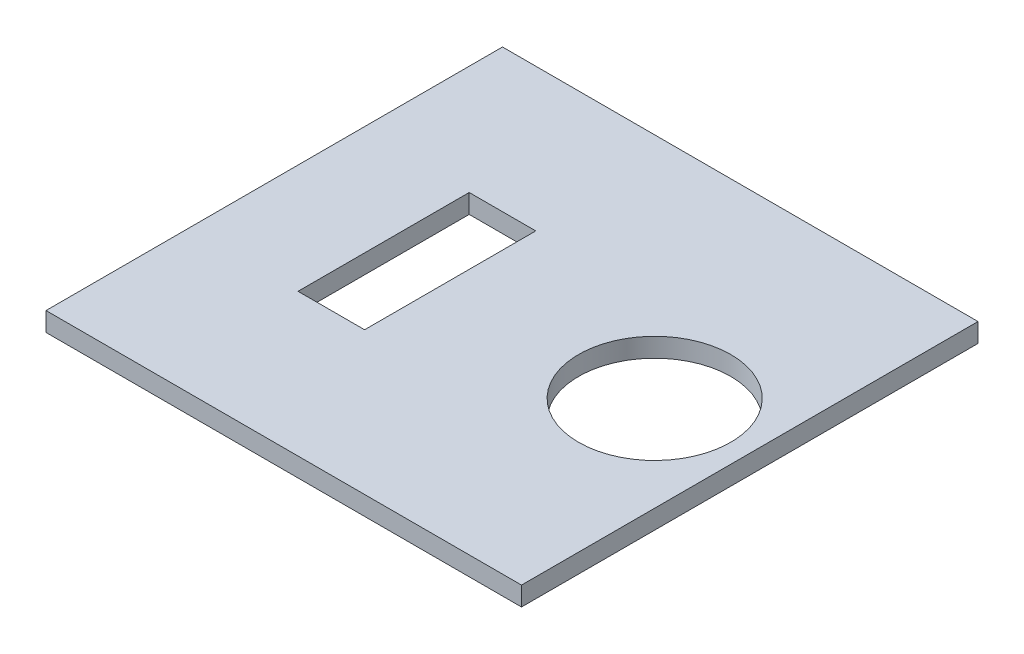
ISO-10303-21;
HEADER;
FILE_DESCRIPTION(('STEP AP214'),'2;1');
FILE_NAME('part.step','',(''),(''),'','','');
FILE_SCHEMA(('AUTOMOTIVE_DESIGN { 1 0 10303 214 1 1 1 1 }'));
ENDSEC;
DATA;
#1=APPLICATION_CONTEXT('core data for automotive mechanical design processes');
#2=APPLICATION_PROTOCOL_DEFINITION('international standard','automotive_design',2000,#1);
#3=PRODUCT_CONTEXT('',#1,'mechanical');
#4=PRODUCT('Part','Part','',(#3));
#5=PRODUCT_RELATED_PRODUCT_CATEGORY('part','',(#4));
#6=PRODUCT_DEFINITION_FORMATION('','',#4);
#7=PRODUCT_DEFINITION_CONTEXT('part definition',#1,'design');
#8=PRODUCT_DEFINITION('design','',#6,#7);
#9=PRODUCT_DEFINITION_SHAPE('','',#8);
#10=(LENGTH_UNIT() NAMED_UNIT(*) SI_UNIT(.MILLI.,.METRE.));
#11=(NAMED_UNIT(*) PLANE_ANGLE_UNIT() SI_UNIT($,.RADIAN.));
#12=(NAMED_UNIT(*) SI_UNIT($,.STERADIAN.) SOLID_ANGLE_UNIT());
#13=UNCERTAINTY_MEASURE_WITH_UNIT(LENGTH_MEASURE(1.E-05),#10,'distance_accuracy_value','');
#14=(GEOMETRIC_REPRESENTATION_CONTEXT(3) GLOBAL_UNCERTAINTY_ASSIGNED_CONTEXT((#13)) GLOBAL_UNIT_ASSIGNED_CONTEXT((#10,
#11,#12)) REPRESENTATION_CONTEXT('',''));
#15=CARTESIAN_POINT('',(0.,0.,0.));
#16=DIRECTION('',(0.,0.,1.));
#17=DIRECTION('',(1.,0.,0.));
#18=AXIS2_PLACEMENT_3D('',#15,#16,#17);
#19=CARTESIAN_POINT('',(0.,1.,0.));
#20=DIRECTION('',(0.,-1.,0.));
#21=DIRECTION('',(0.,0.,-1.));
#22=AXIS2_PLACEMENT_3D('',#19,#20,#21);
#23=PLANE('',#22);
#24=DIRECTION('',(0.,0.,-1.));
#25=VECTOR('',#24,1.);
#26=CARTESIAN_POINT('',(12.5,1.,12.));
#27=LINE('',#26,#25);
#28=CARTESIAN_POINT('',(12.5,1.,12.));
#29=VERTEX_POINT('',#28);
#30=CARTESIAN_POINT('',(12.5,1.,-12.));
#31=VERTEX_POINT('',#30);
#32=EDGE_CURVE('E137',#29,#31,#27,.T.);
#33=ORIENTED_EDGE('',*,*,#32,.T.);
#34=DIRECTION('',(-1.,0.,0.));
#35=VECTOR('',#34,1.);
#36=CARTESIAN_POINT('',(-12.5,1.,-12.));
#37=LINE('',#36,#35);
#38=CARTESIAN_POINT('',(-12.5,1.,-12.));
#39=VERTEX_POINT('',#38);
#40=EDGE_CURVE('E140',#31,#39,#37,.T.);
#41=ORIENTED_EDGE('',*,*,#40,.T.);
#42=DIRECTION('',(0.,0.,1.));
#43=VECTOR('',#42,1.);
#44=CARTESIAN_POINT('',(-12.5,1.,12.));
#45=LINE('',#44,#43);
#46=CARTESIAN_POINT('',(-12.5,1.,12.));
#47=VERTEX_POINT('',#46);
#48=EDGE_CURVE('E143',#39,#47,#45,.T.);
#49=ORIENTED_EDGE('',*,*,#48,.T.);
#50=DIRECTION('',(1.,0.,0.));
#51=VECTOR('',#50,1.);
#52=CARTESIAN_POINT('',(-12.5,1.,12.));
#53=LINE('',#52,#51);
#54=EDGE_CURVE('E145',#47,#29,#53,.T.);
#55=ORIENTED_EDGE('',*,*,#54,.T.);
#56=EDGE_LOOP('',(#33,#41,#49,#55));
#57=FACE_BOUND('',#56,.T.);
#58=DIRECTION('',(0.,0.,-1.));
#59=VECTOR('',#58,1.);
#60=CARTESIAN_POINT('',(-3.25,1.,4.5));
#61=LINE('',#60,#59);
#62=CARTESIAN_POINT('',(-3.25,1.,4.5));
#63=VERTEX_POINT('',#62);
#64=CARTESIAN_POINT('',(-3.25,1.,-4.5));
#65=VERTEX_POINT('',#64);
#66=EDGE_CURVE('E98',#63,#65,#61,.T.);
#67=ORIENTED_EDGE('',*,*,#66,.F.);
#68=DIRECTION('',(1.,0.,0.));
#69=VECTOR('',#68,1.);
#70=CARTESIAN_POINT('',(-6.75,1.,4.5));
#71=LINE('',#70,#69);
#72=CARTESIAN_POINT('',(-6.75,1.,4.5));
#73=VERTEX_POINT('',#72);
#74=EDGE_CURVE('E121',#73,#63,#71,.T.);
#75=ORIENTED_EDGE('',*,*,#74,.F.);
#76=DIRECTION('',(0.,0.,1.));
#77=VECTOR('',#76,1.);
#78=CARTESIAN_POINT('',(-6.75,1.,4.5));
#79=LINE('',#78,#77);
#80=CARTESIAN_POINT('',(-6.75,1.,-4.5));
#81=VERTEX_POINT('',#80);
#82=EDGE_CURVE('E119',#81,#73,#79,.T.);
#83=ORIENTED_EDGE('',*,*,#82,.F.);
#84=DIRECTION('',(-1.,0.,0.));
#85=VECTOR('',#84,1.);
#86=CARTESIAN_POINT('',(-6.75,1.,-4.5));
#87=LINE('',#86,#85);
#88=EDGE_CURVE('E106',#65,#81,#87,.T.);
#89=ORIENTED_EDGE('',*,*,#88,.F.);
#90=EDGE_LOOP('',(#67,#75,#83,#89));
#91=FACE_BOUND('',#90,.T.);
#92=CARTESIAN_POINT('',(7.5,1.,0.));
#93=DIRECTION('',(0.,1.,0.));
#94=DIRECTION('',(0.,0.,1.));
#95=AXIS2_PLACEMENT_3D('',#92,#93,#94);
#96=CIRCLE('',#95,4.);
#97=CARTESIAN_POINT('',(7.5,1.,4.));
#98=VERTEX_POINT('',#97);
#99=EDGE_CURVE('E127',#98,#98,#96,.T.);
#100=ORIENTED_EDGE('',*,*,#99,.F.);
#101=EDGE_LOOP('',(#100));
#102=FACE_BOUND('',#101,.T.);
#103=ADVANCED_FACE('F33',(#57,#91,#102),#23,.F.);
#104=CARTESIAN_POINT('',(0.,0.,0.));
#105=DIRECTION('',(0.,-1.,0.));
#106=DIRECTION('',(0.,0.,-1.));
#107=AXIS2_PLACEMENT_3D('',#104,#105,#106);
#108=PLANE('',#107);
#109=DIRECTION('',(1.,0.,0.));
#110=VECTOR('',#109,1.);
#111=CARTESIAN_POINT('',(-6.75,0.,4.5));
#112=LINE('',#111,#110);
#113=CARTESIAN_POINT('',(-6.75,0.,4.5));
#114=VERTEX_POINT('',#113);
#115=CARTESIAN_POINT('',(-3.25,0.,4.5));
#116=VERTEX_POINT('',#115);
#117=EDGE_CURVE('E107',#114,#116,#112,.T.);
#118=ORIENTED_EDGE('',*,*,#117,.T.);
#119=DIRECTION('',(0.,0.,-1.));
#120=VECTOR('',#119,1.);
#121=CARTESIAN_POINT('',(-3.25,0.,4.5));
#122=LINE('',#121,#120);
#123=CARTESIAN_POINT('',(-3.25,0.,-4.5));
#124=VERTEX_POINT('',#123);
#125=EDGE_CURVE('E56',#116,#124,#122,.T.);
#126=ORIENTED_EDGE('',*,*,#125,.T.);
#127=DIRECTION('',(-1.,0.,0.));
#128=VECTOR('',#127,1.);
#129=CARTESIAN_POINT('',(-6.75,0.,-4.5));
#130=LINE('',#129,#128);
#131=CARTESIAN_POINT('',(-6.75,0.,-4.5));
#132=VERTEX_POINT('',#131);
#133=EDGE_CURVE('E113',#124,#132,#130,.T.);
#134=ORIENTED_EDGE('',*,*,#133,.T.);
#135=DIRECTION('',(0.,0.,1.));
#136=VECTOR('',#135,1.);
#137=CARTESIAN_POINT('',(-6.75,0.,4.5));
#138=LINE('',#137,#136);
#139=EDGE_CURVE('E129',#132,#114,#138,.T.);
#140=ORIENTED_EDGE('',*,*,#139,.T.);
#141=EDGE_LOOP('',(#118,#126,#134,#140));
#142=FACE_BOUND('',#141,.T.);
#143=DIRECTION('',(0.,0.,-1.));
#144=VECTOR('',#143,1.);
#145=CARTESIAN_POINT('',(12.5,0.,12.));
#146=LINE('',#145,#144);
#147=CARTESIAN_POINT('',(12.5,0.,12.));
#148=VERTEX_POINT('',#147);
#149=CARTESIAN_POINT('',(12.5,0.,-12.));
#150=VERTEX_POINT('',#149);
#151=EDGE_CURVE('E114',#148,#150,#146,.T.);
#152=ORIENTED_EDGE('',*,*,#151,.F.);
#153=DIRECTION('',(1.,0.,0.));
#154=VECTOR('',#153,1.);
#155=CARTESIAN_POINT('',(-12.5,0.,12.));
#156=LINE('',#155,#154);
#157=CARTESIAN_POINT('',(-12.5,0.,12.));
#158=VERTEX_POINT('',#157);
#159=EDGE_CURVE('E141',#158,#148,#156,.T.);
#160=ORIENTED_EDGE('',*,*,#159,.F.);
#161=DIRECTION('',(0.,0.,1.));
#162=VECTOR('',#161,1.);
#163=CARTESIAN_POINT('',(-12.5,0.,12.));
#164=LINE('',#163,#162);
#165=CARTESIAN_POINT('',(-12.5,0.,-12.));
#166=VERTEX_POINT('',#165);
#167=EDGE_CURVE('E152',#166,#158,#164,.T.);
#168=ORIENTED_EDGE('',*,*,#167,.F.);
#169=DIRECTION('',(-1.,0.,0.));
#170=VECTOR('',#169,1.);
#171=CARTESIAN_POINT('',(-12.5,0.,-12.));
#172=LINE('',#171,#170);
#173=EDGE_CURVE('E150',#150,#166,#172,.T.);
#174=ORIENTED_EDGE('',*,*,#173,.F.);
#175=EDGE_LOOP('',(#152,#160,#168,#174));
#176=FACE_BOUND('',#175,.T.);
#177=CARTESIAN_POINT('',(7.5,0.,0.));
#178=DIRECTION('',(0.,1.,0.));
#179=DIRECTION('',(0.,0.,1.));
#180=AXIS2_PLACEMENT_3D('',#177,#178,#179);
#181=CIRCLE('',#180,4.);
#182=CARTESIAN_POINT('',(7.5,0.,4.));
#183=VERTEX_POINT('',#182);
#184=EDGE_CURVE('E224',#183,#183,#181,.T.);
#185=ORIENTED_EDGE('',*,*,#184,.T.);
#186=EDGE_LOOP('',(#185));
#187=FACE_BOUND('',#186,.T.);
#188=ADVANCED_FACE('F170',(#142,#176,#187),#108,.T.);
#189=CARTESIAN_POINT('',(12.5,1.,12.));
#190=DIRECTION('',(-1.,0.,0.));
#191=DIRECTION('',(0.,0.,1.));
#192=AXIS2_PLACEMENT_3D('',#189,#190,#191);
#193=PLANE('',#192);
#194=ORIENTED_EDGE('',*,*,#151,.T.);
#195=DIRECTION('',(0.,-1.,0.));
#196=VECTOR('',#195,1.);
#197=CARTESIAN_POINT('',(12.5,1.,-12.));
#198=LINE('',#197,#196);
#199=EDGE_CURVE('E11',#31,#150,#198,.T.);
#200=ORIENTED_EDGE('',*,*,#199,.F.);
#201=ORIENTED_EDGE('',*,*,#32,.F.);
#202=DIRECTION('',(0.,-1.,0.));
#203=VECTOR('',#202,1.);
#204=CARTESIAN_POINT('',(12.5,1.,12.));
#205=LINE('',#204,#203);
#206=EDGE_CURVE('E147',#29,#148,#205,.T.);
#207=ORIENTED_EDGE('',*,*,#206,.T.);
#208=EDGE_LOOP('',(#194,#200,#201,#207));
#209=FACE_BOUND('',#208,.T.);
#210=ADVANCED_FACE('F35',(#209),#193,.F.);
#211=CARTESIAN_POINT('',(-12.5,1.,-12.));
#212=DIRECTION('',(0.,0.,1.));
#213=DIRECTION('',(1.,0.,0.));
#214=AXIS2_PLACEMENT_3D('',#211,#212,#213);
#215=PLANE('',#214);
#216=ORIENTED_EDGE('',*,*,#173,.T.);
#217=DIRECTION('',(0.,-1.,0.));
#218=VECTOR('',#217,1.);
#219=CARTESIAN_POINT('',(-12.5,1.,-12.));
#220=LINE('',#219,#218);
#221=EDGE_CURVE('E41',#39,#166,#220,.T.);
#222=ORIENTED_EDGE('',*,*,#221,.F.);
#223=ORIENTED_EDGE('',*,*,#40,.F.);
#224=ORIENTED_EDGE('',*,*,#199,.T.);
#225=EDGE_LOOP('',(#216,#222,#223,#224));
#226=FACE_BOUND('',#225,.T.);
#227=ADVANCED_FACE('F180',(#226),#215,.F.);
#228=CARTESIAN_POINT('',(-12.5,1.,12.));
#229=DIRECTION('',(1.,0.,0.));
#230=DIRECTION('',(0.,0.,-1.));
#231=AXIS2_PLACEMENT_3D('',#228,#229,#230);
#232=PLANE('',#231);
#233=ORIENTED_EDGE('',*,*,#167,.T.);
#234=DIRECTION('',(0.,-1.,0.));
#235=VECTOR('',#234,1.);
#236=CARTESIAN_POINT('',(-12.5,1.,12.));
#237=LINE('',#236,#235);
#238=EDGE_CURVE('E157',#47,#158,#237,.T.);
#239=ORIENTED_EDGE('',*,*,#238,.F.);
#240=ORIENTED_EDGE('',*,*,#48,.F.);
#241=ORIENTED_EDGE('',*,*,#221,.T.);
#242=EDGE_LOOP('',(#233,#239,#240,#241));
#243=FACE_BOUND('',#242,.T.);
#244=ADVANCED_FACE('F164',(#243),#232,.F.);
#245=CARTESIAN_POINT('',(-12.5,1.,12.));
#246=DIRECTION('',(0.,0.,-1.));
#247=DIRECTION('',(-1.,0.,0.));
#248=AXIS2_PLACEMENT_3D('',#245,#246,#247);
#249=PLANE('',#248);
#250=ORIENTED_EDGE('',*,*,#159,.T.);
#251=ORIENTED_EDGE('',*,*,#206,.F.);
#252=ORIENTED_EDGE('',*,*,#54,.F.);
#253=ORIENTED_EDGE('',*,*,#238,.T.);
#254=EDGE_LOOP('',(#250,#251,#252,#253));
#255=FACE_BOUND('',#254,.T.);
#256=ADVANCED_FACE('F174',(#255),#249,.F.);
#257=CARTESIAN_POINT('',(-3.25,1.,4.5));
#258=DIRECTION('',(-1.,0.,0.));
#259=DIRECTION('',(0.,0.,1.));
#260=AXIS2_PLACEMENT_3D('',#257,#258,#259);
#261=PLANE('',#260);
#262=ORIENTED_EDGE('',*,*,#125,.F.);
#263=DIRECTION('',(0.,-1.,0.));
#264=VECTOR('',#263,1.);
#265=CARTESIAN_POINT('',(-3.25,1.,4.5));
#266=LINE('',#265,#264);
#267=EDGE_CURVE('E102',#63,#116,#266,.T.);
#268=ORIENTED_EDGE('',*,*,#267,.F.);
#269=ORIENTED_EDGE('',*,*,#66,.T.);
#270=DIRECTION('',(0.,-1.,0.));
#271=VECTOR('',#270,1.);
#272=CARTESIAN_POINT('',(-3.25,1.,-4.5));
#273=LINE('',#272,#271);
#274=EDGE_CURVE('E101',#65,#124,#273,.T.);
#275=ORIENTED_EDGE('',*,*,#274,.T.);
#276=EDGE_LOOP('',(#262,#268,#269,#275));
#277=FACE_BOUND('',#276,.T.);
#278=ADVANCED_FACE('F100',(#277),#261,.T.);
#279=CARTESIAN_POINT('',(-6.75,1.,-4.5));
#280=DIRECTION('',(0.,0.,1.));
#281=DIRECTION('',(1.,0.,0.));
#282=AXIS2_PLACEMENT_3D('',#279,#280,#281);
#283=PLANE('',#282);
#284=ORIENTED_EDGE('',*,*,#133,.F.);
#285=ORIENTED_EDGE('',*,*,#274,.F.);
#286=ORIENTED_EDGE('',*,*,#88,.T.);
#287=DIRECTION('',(0.,-1.,0.));
#288=VECTOR('',#287,1.);
#289=CARTESIAN_POINT('',(-6.75,1.,-4.5));
#290=LINE('',#289,#288);
#291=EDGE_CURVE('E115',#81,#132,#290,.T.);
#292=ORIENTED_EDGE('',*,*,#291,.T.);
#293=EDGE_LOOP('',(#284,#285,#286,#292));
#294=FACE_BOUND('',#293,.T.);
#295=ADVANCED_FACE('F110',(#294),#283,.T.);
#296=CARTESIAN_POINT('',(-6.75,1.,4.5));
#297=DIRECTION('',(1.,0.,0.));
#298=DIRECTION('',(0.,0.,-1.));
#299=AXIS2_PLACEMENT_3D('',#296,#297,#298);
#300=PLANE('',#299);
#301=ORIENTED_EDGE('',*,*,#139,.F.);
#302=ORIENTED_EDGE('',*,*,#291,.F.);
#303=ORIENTED_EDGE('',*,*,#82,.T.);
#304=DIRECTION('',(0.,-1.,0.));
#305=VECTOR('',#304,1.);
#306=CARTESIAN_POINT('',(-6.75,1.,4.5));
#307=LINE('',#306,#305);
#308=EDGE_CURVE('E48',#73,#114,#307,.T.);
#309=ORIENTED_EDGE('',*,*,#308,.T.);
#310=EDGE_LOOP('',(#301,#302,#303,#309));
#311=FACE_BOUND('',#310,.T.);
#312=ADVANCED_FACE('F204',(#311),#300,.T.);
#313=CARTESIAN_POINT('',(-6.75,1.,4.5));
#314=DIRECTION('',(0.,0.,-1.));
#315=DIRECTION('',(-1.,0.,0.));
#316=AXIS2_PLACEMENT_3D('',#313,#314,#315);
#317=PLANE('',#316);
#318=ORIENTED_EDGE('',*,*,#117,.F.);
#319=ORIENTED_EDGE('',*,*,#308,.F.);
#320=ORIENTED_EDGE('',*,*,#74,.T.);
#321=ORIENTED_EDGE('',*,*,#267,.T.);
#322=EDGE_LOOP('',(#318,#319,#320,#321));
#323=FACE_BOUND('',#322,.T.);
#324=ADVANCED_FACE('F208',(#323),#317,.T.);
#325=CARTESIAN_POINT('',(7.5,1.,0.));
#326=DIRECTION('',(0.,-1.,0.));
#327=DIRECTION('',(0.,0.,-1.));
#328=AXIS2_PLACEMENT_3D('',#325,#326,#327);
#329=CYLINDRICAL_SURFACE('',#328,4.);
#330=ORIENTED_EDGE('',*,*,#99,.T.);
#331=EDGE_LOOP('',(#330));
#332=FACE_BOUND('',#331,.T.);
#333=ORIENTED_EDGE('',*,*,#184,.F.);
#334=EDGE_LOOP('',(#333));
#335=FACE_BOUND('',#334,.T.);
#336=ADVANCED_FACE('F214',(#332,#335),#329,.F.);
#337=CLOSED_SHELL('',(#103,#188,#210,#227,#244,#256,#278,#295,#312,#324,#336));
#338=MANIFOLD_SOLID_BREP('B2',#337);
#339=ADVANCED_BREP_SHAPE_REPRESENTATION('',(#18,#338),#14);
#340=SHAPE_DEFINITION_REPRESENTATION(#9,#339);
ENDSEC;
END-ISO-10303-21;
